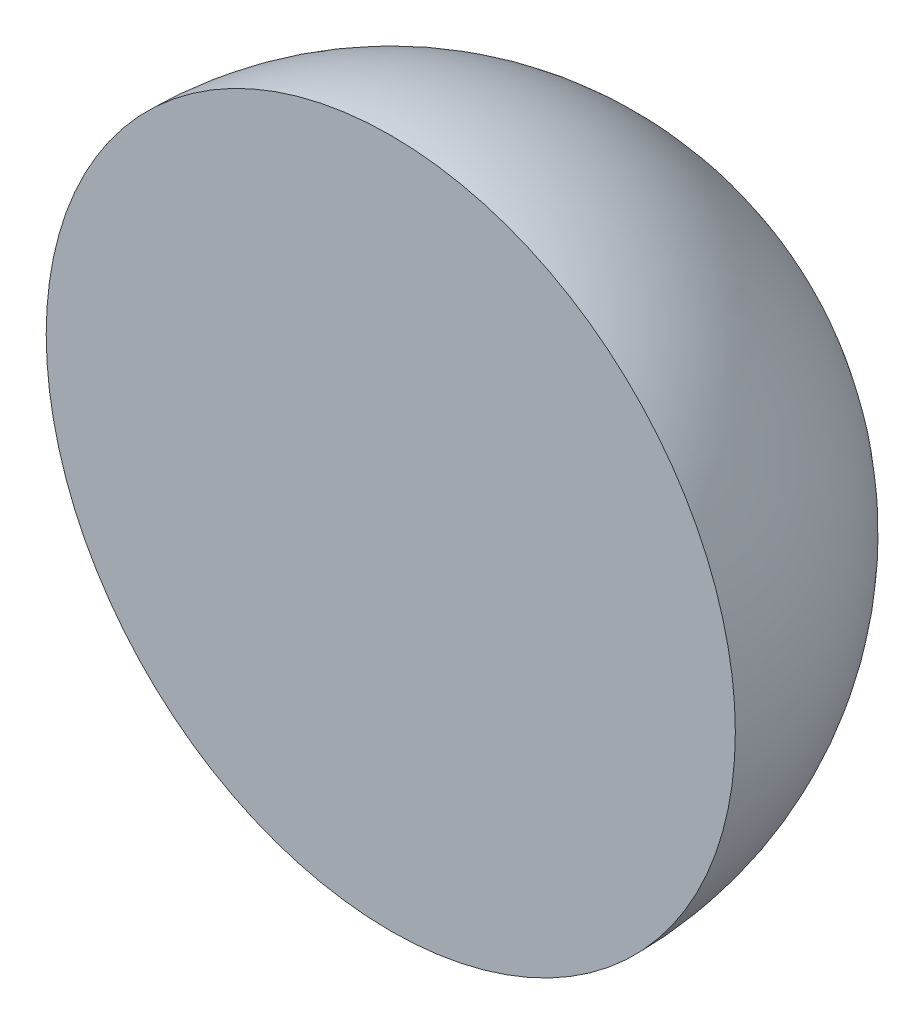
ISO-10303-21;
HEADER;
FILE_DESCRIPTION(('STEP AP214'),'2;1');
FILE_NAME('part.step','',(''),(''),'','','');
FILE_SCHEMA(('AUTOMOTIVE_DESIGN { 1 0 10303 214 1 1 1 1 }'));
ENDSEC;
DATA;
#1=APPLICATION_CONTEXT('core data for automotive mechanical design processes');
#2=APPLICATION_PROTOCOL_DEFINITION('international standard','automotive_design',2000,#1);
#3=PRODUCT_CONTEXT('',#1,'mechanical');
#4=PRODUCT('Part','Part','',(#3));
#5=PRODUCT_RELATED_PRODUCT_CATEGORY('part','',(#4));
#6=PRODUCT_DEFINITION_FORMATION('','',#4);
#7=PRODUCT_DEFINITION_CONTEXT('part definition',#1,'design');
#8=PRODUCT_DEFINITION('design','',#6,#7);
#9=PRODUCT_DEFINITION_SHAPE('','',#8);
#10=(LENGTH_UNIT() NAMED_UNIT(*) SI_UNIT(.MILLI.,.METRE.));
#11=(NAMED_UNIT(*) PLANE_ANGLE_UNIT() SI_UNIT($,.RADIAN.));
#12=(NAMED_UNIT(*) SI_UNIT($,.STERADIAN.) SOLID_ANGLE_UNIT());
#13=UNCERTAINTY_MEASURE_WITH_UNIT(LENGTH_MEASURE(1.E-05),#10,'distance_accuracy_value','');
#14=(GEOMETRIC_REPRESENTATION_CONTEXT(3) GLOBAL_UNCERTAINTY_ASSIGNED_CONTEXT((#13)) GLOBAL_UNIT_ASSIGNED_CONTEXT((#10,
#11,#12)) REPRESENTATION_CONTEXT('',''));
#15=CARTESIAN_POINT('',(0.,0.,0.));
#16=DIRECTION('',(0.,0.,1.));
#17=DIRECTION('',(1.,0.,0.));
#18=AXIS2_PLACEMENT_3D('',#15,#16,#17);
#19=CARTESIAN_POINT('',(0.,0.,-0.89916));
#20=DIRECTION('',(0.,0.,1.));
#21=DIRECTION('',(0.,1.,0.));
#22=AXIS2_PLACEMENT_3D('',#19,#20,#21);
#23=SPHERICAL_SURFACE('',#22,3.59664);
#24=CARTESIAN_POINT('',(0.,0.,-0.89916));
#25=DIRECTION('',(0.,0.,1.));
#26=DIRECTION('',(1.,0.,0.));
#27=AXIS2_PLACEMENT_3D('',#24,#25,#26);
#28=CIRCLE('',#27,3.59664);
#29=CARTESIAN_POINT('',(3.59664,0.,-0.89916));
#30=VERTEX_POINT('',#29);
#31=EDGE_CURVE('E10',#30,#30,#28,.T.);
#32=ORIENTED_EDGE('',*,*,#31,.F.);
#33=EDGE_LOOP('',(#32));
#34=FACE_BOUND('',#33,.T.);
#35=ADVANCED_FACE('F33',(#34),#23,.T.);
#36=CARTESIAN_POINT('',(0.,3.59664,-0.89916));
#37=DIRECTION('',(0.,0.,-1.));
#38=DIRECTION('',(-1.,0.,0.));
#39=AXIS2_PLACEMENT_3D('',#36,#37,#38);
#40=PLANE('',#39);
#41=ORIENTED_EDGE('',*,*,#31,.T.);
#42=EDGE_LOOP('',(#41));
#43=FACE_BOUND('',#42,.T.);
#44=ADVANCED_FACE('F40',(#43),#40,.F.);
#45=CLOSED_SHELL('',(#35,#44));
#46=MANIFOLD_SOLID_BREP('B2',#45);
#47=ADVANCED_BREP_SHAPE_REPRESENTATION('',(#18,#46),#14);
#48=SHAPE_DEFINITION_REPRESENTATION(#9,#47);
ENDSEC;
END-ISO-10303-21;
